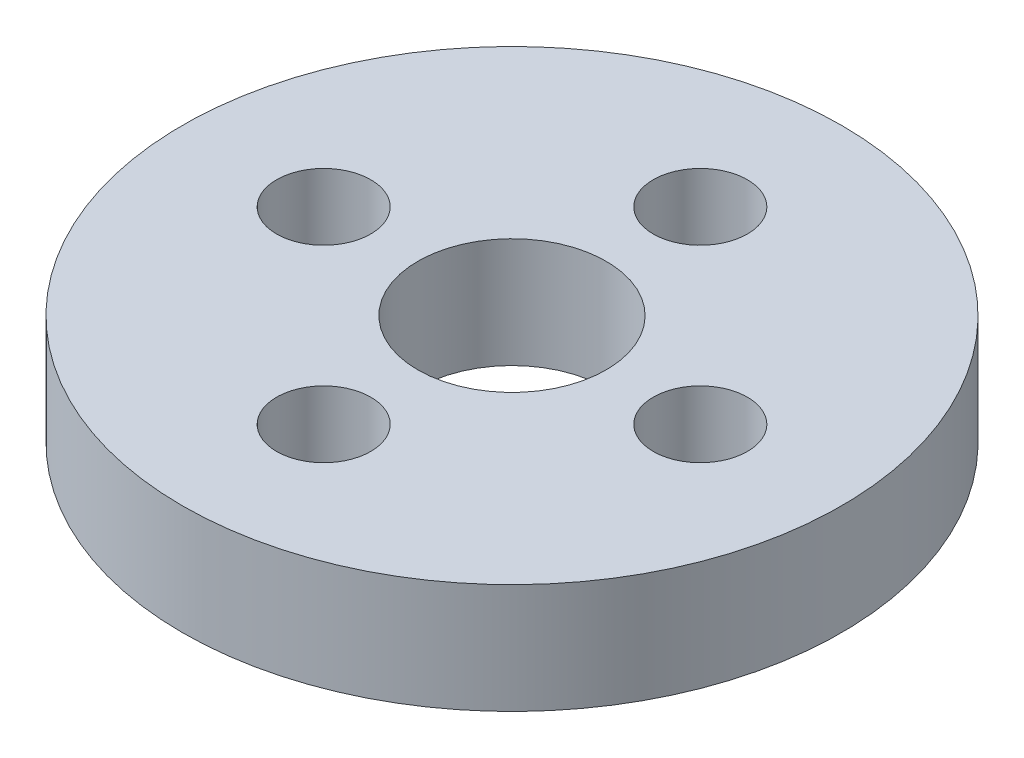
ISO-10303-21;
HEADER;
FILE_DESCRIPTION(('STEP AP214'),'2;1');
FILE_NAME('part.step','',(''),(''),'','','');
FILE_SCHEMA(('AUTOMOTIVE_DESIGN { 1 0 10303 214 1 1 1 1 }'));
ENDSEC;
DATA;
#1=APPLICATION_CONTEXT('core data for automotive mechanical design processes');
#2=APPLICATION_PROTOCOL_DEFINITION('international standard','automotive_design',2000,#1);
#3=PRODUCT_CONTEXT('',#1,'mechanical');
#4=PRODUCT('Part','Part','',(#3));
#5=PRODUCT_RELATED_PRODUCT_CATEGORY('part','',(#4));
#6=PRODUCT_DEFINITION_FORMATION('','',#4);
#7=PRODUCT_DEFINITION_CONTEXT('part definition',#1,'design');
#8=PRODUCT_DEFINITION('design','',#6,#7);
#9=PRODUCT_DEFINITION_SHAPE('','',#8);
#10=(LENGTH_UNIT() NAMED_UNIT(*) SI_UNIT(.MILLI.,.METRE.));
#11=(NAMED_UNIT(*) PLANE_ANGLE_UNIT() SI_UNIT($,.RADIAN.));
#12=(NAMED_UNIT(*) SI_UNIT($,.STERADIAN.) SOLID_ANGLE_UNIT());
#13=UNCERTAINTY_MEASURE_WITH_UNIT(LENGTH_MEASURE(1.E-05),#10,'distance_accuracy_value','');
#14=(GEOMETRIC_REPRESENTATION_CONTEXT(3) GLOBAL_UNCERTAINTY_ASSIGNED_CONTEXT((#13)) GLOBAL_UNIT_ASSIGNED_CONTEXT((#10,
#11,#12)) REPRESENTATION_CONTEXT('',''));
#15=CARTESIAN_POINT('',(0.,0.,0.));
#16=DIRECTION('',(0.,0.,1.));
#17=DIRECTION('',(1.,0.,0.));
#18=AXIS2_PLACEMENT_3D('',#15,#16,#17);
#19=CARTESIAN_POINT('',(0.,3.5,0.));
#20=DIRECTION('',(0.,-1.,0.));
#21=DIRECTION('',(0.,0.,-1.));
#22=AXIS2_PLACEMENT_3D('',#19,#20,#21);
#23=CYLINDRICAL_SURFACE('',#22,10.5);
#24=CARTESIAN_POINT('',(0.,3.5,0.));
#25=DIRECTION('',(0.,1.,0.));
#26=DIRECTION('',(0.,0.,1.));
#27=AXIS2_PLACEMENT_3D('',#24,#25,#26);
#28=CIRCLE('',#27,10.5);
#29=CARTESIAN_POINT('',(0.,3.5,-10.5));
#30=VERTEX_POINT('',#29);
#31=EDGE_CURVE('E10',#30,#30,#28,.T.);
#32=CARTESIAN_POINT('',(0.,0.,0.));
#33=DIRECTION('',(0.,1.,0.));
#34=DIRECTION('',(0.,0.,1.));
#35=AXIS2_PLACEMENT_3D('',#32,#33,#34);
#36=CIRCLE('',#35,10.5);
#37=CARTESIAN_POINT('',(0.,0.,-10.5));
#38=VERTEX_POINT('',#37);
#39=EDGE_CURVE('E42',#38,#38,#36,.T.);
#40=CARTESIAN_POINT('',(0.,3.5,-10.5));
#41=CARTESIAN_POINT('',(0.,3.46354166666667,-10.5));
#42=CARTESIAN_POINT('',(0.,3.42708333333333,-10.5));
#43=CARTESIAN_POINT('',(0.,3.35416666666667,-10.5));
#44=CARTESIAN_POINT('',(0.,3.31770833333333,-10.5));
#45=CARTESIAN_POINT('',(0.,3.24479166666667,-10.5));
#46=CARTESIAN_POINT('',(0.,3.20833333333333,-10.5));
#47=CARTESIAN_POINT('',(0.,3.13541666666667,-10.5));
#48=CARTESIAN_POINT('',(0.,3.09895833333333,-10.5));
#49=CARTESIAN_POINT('',(0.,3.02604166666667,-10.5));
#50=CARTESIAN_POINT('',(0.,2.98958333333333,-10.5));
#51=CARTESIAN_POINT('',(0.,2.91666666666667,-10.5));
#52=CARTESIAN_POINT('',(0.,2.88020833333333,-10.5));
#53=CARTESIAN_POINT('',(0.,2.80729166666667,-10.5));
#54=CARTESIAN_POINT('',(0.,2.77083333333333,-10.5));
#55=CARTESIAN_POINT('',(0.,2.69791666666667,-10.5));
#56=CARTESIAN_POINT('',(0.,2.66145833333333,-10.5));
#57=CARTESIAN_POINT('',(0.,2.58854166666667,-10.5));
#58=CARTESIAN_POINT('',(0.,2.55208333333333,-10.5));
#59=CARTESIAN_POINT('',(0.,2.47916666666667,-10.5));
#60=CARTESIAN_POINT('',(0.,2.44270833333333,-10.5));
#61=CARTESIAN_POINT('',(0.,2.36979166666667,-10.5));
#62=CARTESIAN_POINT('',(0.,2.33333333333333,-10.5));
#63=CARTESIAN_POINT('',(0.,2.26041666666667,-10.5));
#64=CARTESIAN_POINT('',(0.,2.22395833333333,-10.5));
#65=CARTESIAN_POINT('',(0.,2.15104166666667,-10.5));
#66=CARTESIAN_POINT('',(0.,2.11458333333333,-10.5));
#67=CARTESIAN_POINT('',(0.,2.04166666666667,-10.5));
#68=CARTESIAN_POINT('',(0.,2.00520833333333,-10.5));
#69=CARTESIAN_POINT('',(0.,1.93229166666667,-10.5));
#70=CARTESIAN_POINT('',(0.,1.89583333333333,-10.5));
#71=CARTESIAN_POINT('',(0.,1.82291666666667,-10.5));
#72=CARTESIAN_POINT('',(0.,1.78645833333333,-10.5));
#73=CARTESIAN_POINT('',(0.,1.71354166666667,-10.5));
#74=CARTESIAN_POINT('',(0.,1.67708333333333,-10.5));
#75=CARTESIAN_POINT('',(0.,1.60416666666667,-10.5));
#76=CARTESIAN_POINT('',(0.,1.56770833333333,-10.5));
#77=CARTESIAN_POINT('',(0.,1.49479166666667,-10.5));
#78=CARTESIAN_POINT('',(0.,1.45833333333333,-10.5));
#79=CARTESIAN_POINT('',(0.,1.38541666666667,-10.5));
#80=CARTESIAN_POINT('',(0.,1.34895833333333,-10.5));
#81=CARTESIAN_POINT('',(0.,1.27604166666667,-10.5));
#82=CARTESIAN_POINT('',(0.,1.23958333333333,-10.5));
#83=CARTESIAN_POINT('',(0.,1.16666666666667,-10.5));
#84=CARTESIAN_POINT('',(0.,1.13020833333333,-10.5));
#85=CARTESIAN_POINT('',(0.,1.05729166666667,-10.5));
#86=CARTESIAN_POINT('',(0.,1.02083333333333,-10.5));
#87=CARTESIAN_POINT('',(0.,0.947916666666666,-10.5));
#88=CARTESIAN_POINT('',(0.,0.911458333333333,-10.5));
#89=CARTESIAN_POINT('',(0.,0.838541666666666,-10.5));
#90=CARTESIAN_POINT('',(0.,0.802083333333333,-10.5));
#91=CARTESIAN_POINT('',(0.,0.729166666666667,-10.5));
#92=CARTESIAN_POINT('',(0.,0.692708333333333,-10.5));
#93=CARTESIAN_POINT('',(0.,0.619791666666666,-10.5));
#94=CARTESIAN_POINT('',(0.,0.583333333333333,-10.5));
#95=CARTESIAN_POINT('',(0.,0.510416666666666,-10.5));
#96=CARTESIAN_POINT('',(0.,0.473958333333333,-10.5));
#97=CARTESIAN_POINT('',(0.,0.401041666666666,-10.5));
#98=CARTESIAN_POINT('',(0.,0.364583333333333,-10.5));
#99=CARTESIAN_POINT('',(0.,0.291666666666666,-10.5));
#100=CARTESIAN_POINT('',(0.,0.255208333333333,-10.5));
#101=CARTESIAN_POINT('',(0.,0.182291666666666,-10.5));
#102=CARTESIAN_POINT('',(0.,0.145833333333333,-10.5));
#103=CARTESIAN_POINT('',(0.,0.0729166666666663,-10.5));
#104=CARTESIAN_POINT('',(0.,0.0364583333333329,-10.5));
#105=CARTESIAN_POINT('',(0.,0.,-10.5));
#106=B_SPLINE_CURVE_WITH_KNOTS('',3,(#40,#41,#42,#43,#44,#45,#46,#47,#48,#49,#50,#51,#52,#53,
#54,#55,#56,#57,#58,#59,#60,#61,#62,#63,#64,#65,#66,#67,#68,#69,#70,#71,#72,#73,#74,#75,#76,#77,
#78,#79,#80,#81,#82,#83,#84,#85,#86,#87,#88,#89,#90,#91,#92,#93,#94,#95,#96,#97,#98,#99,#100,
#101,#102,#103,#104,#105),.UNSPECIFIED.,.F.,.F.,(4,2,2,2,2,2,2,2,2,2,2,2,2,2,2,2,2,2,2,2,2,2,2,
2,2,2,2,2,2,2,2,2,4),(0.,0.109375,0.21875,0.328125,0.4375,0.546875,0.65625,0.765625,0.875,
0.984375,1.09375,1.203125,1.3125,1.421875,1.53125,1.640625,1.75,1.859375,1.96875,2.078125,
2.1875,2.296875,2.40625,2.515625,2.625,2.734375,2.84375,2.953125,3.0625,3.171875,3.28125,
3.390625,3.5),.UNSPECIFIED.);
#107=EDGE_CURVE('BSEAM35',#30,#38,#106,.T.);
#108=ORIENTED_EDGE('',*,*,#31,.F.);
#109=ORIENTED_EDGE('',*,*,#39,.T.);
#110=ORIENTED_EDGE('',*,*,#107,.T.);
#111=ORIENTED_EDGE('',*,*,#107,.F.);
#112=EDGE_LOOP('',(#108,#110,#109,#111));
#113=FACE_BOUND('',#112,.T.);
#114=ADVANCED_FACE('F35',(#113),#23,.T.);
#115=CARTESIAN_POINT('',(0.,3.5,0.));
#116=DIRECTION('',(0.,1.,0.));
#117=DIRECTION('',(0.,0.,1.));
#118=AXIS2_PLACEMENT_3D('',#115,#116,#117);
#119=PLANE('',#118);
#120=CARTESIAN_POINT('',(0.,3.5,-6.));
#121=DIRECTION('',(0.,1.,0.));
#122=DIRECTION('',(0.,0.,1.));
#123=AXIS2_PLACEMENT_3D('',#120,#121,#122);
#124=CIRCLE('',#123,1.50000000000043);
#125=CARTESIAN_POINT('',(0.,3.5,-4.49999999999957));
#126=VERTEX_POINT('',#125);
#127=EDGE_CURVE('E111',#126,#126,#124,.T.);
#128=ORIENTED_EDGE('',*,*,#127,.F.);
#129=EDGE_LOOP('',(#128));
#130=FACE_BOUND('',#129,.T.);
#131=CARTESIAN_POINT('',(6.0000000000002,3.5,-1.98033480913468E-13));
#132=DIRECTION('',(0.,1.,0.));
#133=DIRECTION('',(0.,0.,1.));
#134=AXIS2_PLACEMENT_3D('',#131,#132,#133);
#135=CIRCLE('',#134,1.50000000000042);
#136=CARTESIAN_POINT('',(6.0000000000002,3.5,1.50000000000023));
#137=VERTEX_POINT('',#136);
#138=EDGE_CURVE('E112',#137,#137,#135,.T.);
#139=ORIENTED_EDGE('',*,*,#138,.F.);
#140=EDGE_LOOP('',(#139));
#141=FACE_BOUND('',#140,.T.);
#142=CARTESIAN_POINT('',(3.96066961826935E-13,3.5,6.));
#143=DIRECTION('',(0.,1.,0.));
#144=DIRECTION('',(0.,0.,1.));
#145=AXIS2_PLACEMENT_3D('',#142,#143,#144);
#146=CIRCLE('',#145,1.50000000000043);
#147=CARTESIAN_POINT('',(3.96066961826935E-13,3.5,7.50000000000043));
#148=VERTEX_POINT('',#147);
#149=EDGE_CURVE('E116',#148,#148,#146,.T.);
#150=ORIENTED_EDGE('',*,*,#149,.F.);
#151=EDGE_LOOP('',(#150));
#152=FACE_BOUND('',#151,.T.);
#153=CARTESIAN_POINT('',(-5.9999999999998,3.5,1.98768268992956E-13));
#154=DIRECTION('',(0.,1.,0.));
#155=DIRECTION('',(0.,0.,1.));
#156=AXIS2_PLACEMENT_3D('',#153,#154,#155);
#157=CIRCLE('',#156,1.50000000000042);
#158=CARTESIAN_POINT('',(-5.9999999999998,3.5,1.50000000000062));
#159=VERTEX_POINT('',#158);
#160=EDGE_CURVE('E118',#159,#159,#157,.T.);
#161=ORIENTED_EDGE('',*,*,#160,.F.);
#162=EDGE_LOOP('',(#161));
#163=FACE_BOUND('',#162,.T.);
#164=CARTESIAN_POINT('',(0.,3.5,0.));
#165=DIRECTION('',(0.,1.,0.));
#166=DIRECTION('',(0.,0.,1.));
#167=AXIS2_PLACEMENT_3D('',#164,#165,#166);
#168=CIRCLE('',#167,3.);
#169=CARTESIAN_POINT('',(0.,3.5,3.));
#170=VERTEX_POINT('',#169);
#171=EDGE_CURVE('E49',#170,#170,#168,.T.);
#172=ORIENTED_EDGE('',*,*,#171,.F.);
#173=EDGE_LOOP('',(#172));
#174=FACE_BOUND('',#173,.T.);
#175=ORIENTED_EDGE('',*,*,#31,.T.);
#176=EDGE_LOOP('',(#175));
#177=FACE_BOUND('',#176,.T.);
#178=ADVANCED_FACE('F83',(#130,#141,#152,#163,#174,#177),#119,.T.);
#179=CARTESIAN_POINT('',(0.,0.,0.));
#180=DIRECTION('',(0.,1.,0.));
#181=DIRECTION('',(0.,0.,1.));
#182=AXIS2_PLACEMENT_3D('',#179,#180,#181);
#183=PLANE('',#182);
#184=CARTESIAN_POINT('',(0.,0.,-6.));
#185=DIRECTION('',(0.,1.,0.));
#186=DIRECTION('',(0.,0.,1.));
#187=AXIS2_PLACEMENT_3D('',#184,#185,#186);
#188=CIRCLE('',#187,1.50000000000043);
#189=CARTESIAN_POINT('',(0.,0.,-4.49999999999957));
#190=VERTEX_POINT('',#189);
#191=EDGE_CURVE('E38',#190,#190,#188,.T.);
#192=ORIENTED_EDGE('',*,*,#191,.T.);
#193=EDGE_LOOP('',(#192));
#194=FACE_BOUND('',#193,.T.);
#195=CARTESIAN_POINT('',(6.0000000000002,0.,-1.98033480913468E-13));
#196=DIRECTION('',(0.,1.,0.));
#197=DIRECTION('',(0.,0.,1.));
#198=AXIS2_PLACEMENT_3D('',#195,#196,#197);
#199=CIRCLE('',#198,1.50000000000042);
#200=CARTESIAN_POINT('',(6.0000000000002,0.,1.50000000000023));
#201=VERTEX_POINT('',#200);
#202=EDGE_CURVE('E60',#201,#201,#199,.T.);
#203=ORIENTED_EDGE('',*,*,#202,.T.);
#204=EDGE_LOOP('',(#203));
#205=FACE_BOUND('',#204,.T.);
#206=CARTESIAN_POINT('',(3.96066961826935E-13,0.,6.));
#207=DIRECTION('',(0.,1.,0.));
#208=DIRECTION('',(0.,0.,1.));
#209=AXIS2_PLACEMENT_3D('',#206,#207,#208);
#210=CIRCLE('',#209,1.50000000000043);
#211=CARTESIAN_POINT('',(3.96066961826935E-13,0.,7.50000000000043));
#212=VERTEX_POINT('',#211);
#213=EDGE_CURVE('E58',#212,#212,#210,.T.);
#214=ORIENTED_EDGE('',*,*,#213,.T.);
#215=EDGE_LOOP('',(#214));
#216=FACE_BOUND('',#215,.T.);
#217=CARTESIAN_POINT('',(-5.9999999999998,0.,1.98768268992956E-13));
#218=DIRECTION('',(0.,1.,0.));
#219=DIRECTION('',(0.,0.,1.));
#220=AXIS2_PLACEMENT_3D('',#217,#218,#219);
#221=CIRCLE('',#220,1.50000000000042);
#222=CARTESIAN_POINT('',(-5.9999999999998,0.,1.50000000000062));
#223=VERTEX_POINT('',#222);
#224=EDGE_CURVE('E55',#223,#223,#221,.T.);
#225=ORIENTED_EDGE('',*,*,#224,.T.);
#226=EDGE_LOOP('',(#225));
#227=FACE_BOUND('',#226,.T.);
#228=CARTESIAN_POINT('',(0.,0.,0.));
#229=DIRECTION('',(0.,1.,0.));
#230=DIRECTION('',(0.,0.,1.));
#231=AXIS2_PLACEMENT_3D('',#228,#229,#230);
#232=CIRCLE('',#231,3.);
#233=CARTESIAN_POINT('',(0.,0.,3.));
#234=VERTEX_POINT('',#233);
#235=EDGE_CURVE('E52',#234,#234,#232,.T.);
#236=ORIENTED_EDGE('',*,*,#235,.T.);
#237=EDGE_LOOP('',(#236));
#238=FACE_BOUND('',#237,.T.);
#239=ORIENTED_EDGE('',*,*,#39,.F.);
#240=EDGE_LOOP('',(#239));
#241=FACE_BOUND('',#240,.T.);
#242=ADVANCED_FACE('F67',(#194,#205,#216,#227,#238,#241),#183,.F.);
#243=CARTESIAN_POINT('',(0.,-6.7,0.));
#244=DIRECTION('',(0.,1.,0.));
#245=DIRECTION('',(0.,0.,1.));
#246=AXIS2_PLACEMENT_3D('',#243,#244,#245);
#247=CYLINDRICAL_SURFACE('',#246,3.);
#248=ORIENTED_EDGE('',*,*,#171,.T.);
#249=EDGE_LOOP('',(#248));
#250=FACE_BOUND('',#249,.T.);
#251=ORIENTED_EDGE('',*,*,#235,.F.);
#252=EDGE_LOOP('',(#251));
#253=FACE_BOUND('',#252,.T.);
#254=ADVANCED_FACE('F94',(#250,#253),#247,.F.);
#255=CARTESIAN_POINT('',(-5.9999999999998,-6.7,1.98768268992956E-13));
#256=DIRECTION('',(0.,1.,0.));
#257=DIRECTION('',(0.,0.,1.));
#258=AXIS2_PLACEMENT_3D('',#255,#256,#257);
#259=CYLINDRICAL_SURFACE('',#258,1.50000000000042);
#260=ORIENTED_EDGE('',*,*,#160,.T.);
#261=EDGE_LOOP('',(#260));
#262=FACE_BOUND('',#261,.T.);
#263=ORIENTED_EDGE('',*,*,#224,.F.);
#264=EDGE_LOOP('',(#263));
#265=FACE_BOUND('',#264,.T.);
#266=ADVANCED_FACE('F98',(#262,#265),#259,.F.);
#267=CARTESIAN_POINT('',(3.96066961826935E-13,-6.7,6.));
#268=DIRECTION('',(0.,1.,0.));
#269=DIRECTION('',(0.,0.,1.));
#270=AXIS2_PLACEMENT_3D('',#267,#268,#269);
#271=CYLINDRICAL_SURFACE('',#270,1.50000000000043);
#272=ORIENTED_EDGE('',*,*,#149,.T.);
#273=EDGE_LOOP('',(#272));
#274=FACE_BOUND('',#273,.T.);
#275=ORIENTED_EDGE('',*,*,#213,.F.);
#276=EDGE_LOOP('',(#275));
#277=FACE_BOUND('',#276,.T.);
#278=ADVANCED_FACE('F77',(#274,#277),#271,.F.);
#279=CARTESIAN_POINT('',(6.0000000000002,-6.7,-1.98033480913468E-13));
#280=DIRECTION('',(0.,1.,0.));
#281=DIRECTION('',(0.,0.,1.));
#282=AXIS2_PLACEMENT_3D('',#279,#280,#281);
#283=CYLINDRICAL_SURFACE('',#282,1.50000000000042);
#284=ORIENTED_EDGE('',*,*,#138,.T.);
#285=EDGE_LOOP('',(#284));
#286=FACE_BOUND('',#285,.T.);
#287=ORIENTED_EDGE('',*,*,#202,.F.);
#288=EDGE_LOOP('',(#287));
#289=FACE_BOUND('',#288,.T.);
#290=ADVANCED_FACE('F71',(#286,#289),#283,.F.);
#291=CARTESIAN_POINT('',(0.,-6.7,-6.));
#292=DIRECTION('',(0.,1.,0.));
#293=DIRECTION('',(0.,0.,1.));
#294=AXIS2_PLACEMENT_3D('',#291,#292,#293);
#295=CYLINDRICAL_SURFACE('',#294,1.50000000000043);
#296=ORIENTED_EDGE('',*,*,#127,.T.);
#297=EDGE_LOOP('',(#296));
#298=FACE_BOUND('',#297,.T.);
#299=ORIENTED_EDGE('',*,*,#191,.F.);
#300=EDGE_LOOP('',(#299));
#301=FACE_BOUND('',#300,.T.);
#302=ADVANCED_FACE('F69',(#298,#301),#295,.F.);
#303=CLOSED_SHELL('',(#114,#178,#242,#254,#266,#278,#290,#302));
#304=MANIFOLD_SOLID_BREP('B2',#303);
#305=ADVANCED_BREP_SHAPE_REPRESENTATION('',(#18,#304),#14);
#306=SHAPE_DEFINITION_REPRESENTATION(#9,#305);
ENDSEC;
END-ISO-10303-21;
